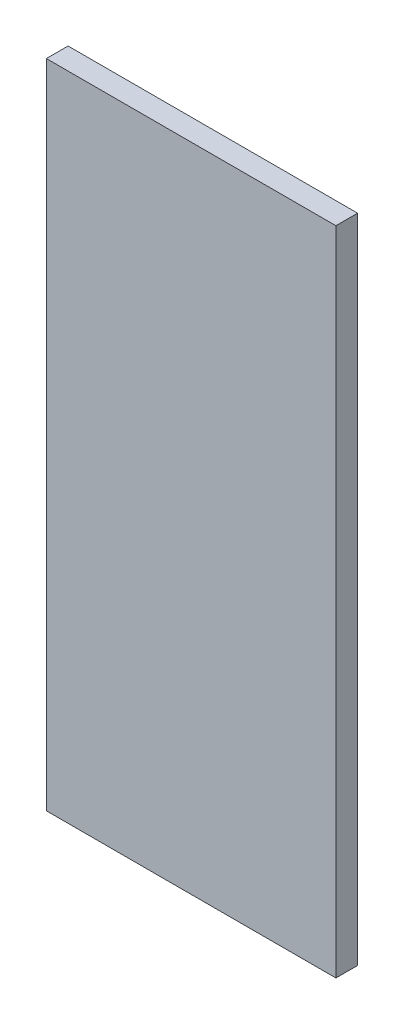
ISO-10303-21;
HEADER;
FILE_DESCRIPTION(('STEP AP214'),'2;1');
FILE_NAME('part.step','',(''),(''),'','','');
FILE_SCHEMA(('AUTOMOTIVE_DESIGN { 1 0 10303 214 1 1 1 1 }'));
ENDSEC;
DATA;
#1=APPLICATION_CONTEXT('core data for automotive mechanical design processes');
#2=APPLICATION_PROTOCOL_DEFINITION('international standard','automotive_design',2000,#1);
#3=PRODUCT_CONTEXT('',#1,'mechanical');
#4=PRODUCT('Part','Part','',(#3));
#5=PRODUCT_RELATED_PRODUCT_CATEGORY('part','',(#4));
#6=PRODUCT_DEFINITION_FORMATION('','',#4);
#7=PRODUCT_DEFINITION_CONTEXT('part definition',#1,'design');
#8=PRODUCT_DEFINITION('design','',#6,#7);
#9=PRODUCT_DEFINITION_SHAPE('','',#8);
#10=(LENGTH_UNIT() NAMED_UNIT(*) SI_UNIT(.MILLI.,.METRE.));
#11=(NAMED_UNIT(*) PLANE_ANGLE_UNIT() SI_UNIT($,.RADIAN.));
#12=(NAMED_UNIT(*) SI_UNIT($,.STERADIAN.) SOLID_ANGLE_UNIT());
#13=UNCERTAINTY_MEASURE_WITH_UNIT(LENGTH_MEASURE(1.E-05),#10,'distance_accuracy_value','');
#14=(GEOMETRIC_REPRESENTATION_CONTEXT(3) GLOBAL_UNCERTAINTY_ASSIGNED_CONTEXT((#13)) GLOBAL_UNIT_ASSIGNED_CONTEXT((#10,
#11,#12)) REPRESENTATION_CONTEXT('',''));
#15=CARTESIAN_POINT('',(0.,0.,0.));
#16=DIRECTION('',(0.,0.,1.));
#17=DIRECTION('',(1.,0.,0.));
#18=AXIS2_PLACEMENT_3D('',#15,#16,#17);
#19=CARTESIAN_POINT('',(-20.,45.,3.));
#20=DIRECTION('',(1.,0.,0.));
#21=DIRECTION('',(0.,0.,-1.));
#22=AXIS2_PLACEMENT_3D('',#19,#20,#21);
#23=PLANE('',#22);
#24=DIRECTION('',(0.,-1.,0.));
#25=VECTOR('',#24,1.);
#26=CARTESIAN_POINT('',(-20.,45.,0.));
#27=LINE('',#26,#25);
#28=CARTESIAN_POINT('',(-20.,45.,0.));
#29=VERTEX_POINT('',#28);
#30=CARTESIAN_POINT('',(-20.,-45.,0.));
#31=VERTEX_POINT('',#30);
#32=EDGE_CURVE('E102',#29,#31,#27,.T.);
#33=ORIENTED_EDGE('',*,*,#32,.T.);
#34=DIRECTION('',(0.,0.,-1.));
#35=VECTOR('',#34,1.);
#36=CARTESIAN_POINT('',(-20.,-45.,3.));
#37=LINE('',#36,#35);
#38=CARTESIAN_POINT('',(-20.,-45.,3.));
#39=VERTEX_POINT('',#38);
#40=EDGE_CURVE('E11',#39,#31,#37,.T.);
#41=ORIENTED_EDGE('',*,*,#40,.F.);
#42=DIRECTION('',(0.,-1.,0.));
#43=VECTOR('',#42,1.);
#44=CARTESIAN_POINT('',(-20.,45.,3.));
#45=LINE('',#44,#43);
#46=CARTESIAN_POINT('',(-20.,45.,3.));
#47=VERTEX_POINT('',#46);
#48=EDGE_CURVE('E90',#47,#39,#45,.T.);
#49=ORIENTED_EDGE('',*,*,#48,.F.);
#50=DIRECTION('',(0.,0.,-1.));
#51=VECTOR('',#50,1.);
#52=CARTESIAN_POINT('',(-20.,45.,3.));
#53=LINE('',#52,#51);
#54=EDGE_CURVE('E98',#47,#29,#53,.T.);
#55=ORIENTED_EDGE('',*,*,#54,.T.);
#56=EDGE_LOOP('',(#33,#41,#49,#55));
#57=FACE_BOUND('',#56,.T.);
#58=ADVANCED_FACE('F39',(#57),#23,.F.);
#59=CARTESIAN_POINT('',(-20.,-45.,3.));
#60=DIRECTION('',(0.,1.,0.));
#61=DIRECTION('',(0.,0.,1.));
#62=AXIS2_PLACEMENT_3D('',#59,#60,#61);
#63=PLANE('',#62);
#64=DIRECTION('',(1.,0.,0.));
#65=VECTOR('',#64,1.);
#66=CARTESIAN_POINT('',(-20.,-45.,0.));
#67=LINE('',#66,#65);
#68=CARTESIAN_POINT('',(20.,-45.,0.));
#69=VERTEX_POINT('',#68);
#70=EDGE_CURVE('E94',#31,#69,#67,.T.);
#71=ORIENTED_EDGE('',*,*,#70,.T.);
#72=DIRECTION('',(0.,0.,-1.));
#73=VECTOR('',#72,1.);
#74=CARTESIAN_POINT('',(20.,-45.,3.));
#75=LINE('',#74,#73);
#76=CARTESIAN_POINT('',(20.,-45.,3.));
#77=VERTEX_POINT('',#76);
#78=EDGE_CURVE('E47',#77,#69,#75,.T.);
#79=ORIENTED_EDGE('',*,*,#78,.F.);
#80=DIRECTION('',(1.,0.,0.));
#81=VECTOR('',#80,1.);
#82=CARTESIAN_POINT('',(-20.,-45.,3.));
#83=LINE('',#82,#81);
#84=EDGE_CURVE('E85',#39,#77,#83,.T.);
#85=ORIENTED_EDGE('',*,*,#84,.F.);
#86=ORIENTED_EDGE('',*,*,#40,.T.);
#87=EDGE_LOOP('',(#71,#79,#85,#86));
#88=FACE_BOUND('',#87,.T.);
#89=ADVANCED_FACE('F93',(#88),#63,.F.);
#90=CARTESIAN_POINT('',(20.,-45.,3.));
#91=DIRECTION('',(-1.,0.,0.));
#92=DIRECTION('',(0.,0.,1.));
#93=AXIS2_PLACEMENT_3D('',#90,#91,#92);
#94=PLANE('',#93);
#95=DIRECTION('',(0.,1.,0.));
#96=VECTOR('',#95,1.);
#97=CARTESIAN_POINT('',(20.,-45.,0.));
#98=LINE('',#97,#96);
#99=CARTESIAN_POINT('',(20.,45.,0.));
#100=VERTEX_POINT('',#99);
#101=EDGE_CURVE('E72',#69,#100,#98,.T.);
#102=ORIENTED_EDGE('',*,*,#101,.T.);
#103=DIRECTION('',(0.,0.,-1.));
#104=VECTOR('',#103,1.);
#105=CARTESIAN_POINT('',(20.,45.,3.));
#106=LINE('',#105,#104);
#107=CARTESIAN_POINT('',(20.,45.,3.));
#108=VERTEX_POINT('',#107);
#109=EDGE_CURVE('E95',#108,#100,#106,.T.);
#110=ORIENTED_EDGE('',*,*,#109,.F.);
#111=DIRECTION('',(0.,1.,0.));
#112=VECTOR('',#111,1.);
#113=CARTESIAN_POINT('',(20.,-45.,3.));
#114=LINE('',#113,#112);
#115=EDGE_CURVE('E88',#77,#108,#114,.T.);
#116=ORIENTED_EDGE('',*,*,#115,.F.);
#117=ORIENTED_EDGE('',*,*,#78,.T.);
#118=EDGE_LOOP('',(#102,#110,#116,#117));
#119=FACE_BOUND('',#118,.T.);
#120=ADVANCED_FACE('F96',(#119),#94,.F.);
#121=CARTESIAN_POINT('',(20.,45.,3.));
#122=DIRECTION('',(0.,-1.,0.));
#123=DIRECTION('',(0.,0.,-1.));
#124=AXIS2_PLACEMENT_3D('',#121,#122,#123);
#125=PLANE('',#124);
#126=DIRECTION('',(-1.,0.,0.));
#127=VECTOR('',#126,1.);
#128=CARTESIAN_POINT('',(20.,45.,0.));
#129=LINE('',#128,#127);
#130=EDGE_CURVE('E78',#100,#29,#129,.T.);
#131=ORIENTED_EDGE('',*,*,#130,.T.);
#132=ORIENTED_EDGE('',*,*,#54,.F.);
#133=DIRECTION('',(-1.,0.,0.));
#134=VECTOR('',#133,1.);
#135=CARTESIAN_POINT('',(20.,45.,3.));
#136=LINE('',#135,#134);
#137=EDGE_CURVE('E55',#108,#47,#136,.T.);
#138=ORIENTED_EDGE('',*,*,#137,.F.);
#139=ORIENTED_EDGE('',*,*,#109,.T.);
#140=EDGE_LOOP('',(#131,#132,#138,#139));
#141=FACE_BOUND('',#140,.T.);
#142=ADVANCED_FACE('F109',(#141),#125,.F.);
#143=CARTESIAN_POINT('',(0.,0.,3.));
#144=DIRECTION('',(0.,0.,1.));
#145=DIRECTION('',(1.,0.,0.));
#146=AXIS2_PLACEMENT_3D('',#143,#144,#145);
#147=PLANE('',#146);
#148=ORIENTED_EDGE('',*,*,#48,.T.);
#149=ORIENTED_EDGE('',*,*,#84,.T.);
#150=ORIENTED_EDGE('',*,*,#115,.T.);
#151=ORIENTED_EDGE('',*,*,#137,.T.);
#152=EDGE_LOOP('',(#148,#149,#150,#151));
#153=FACE_BOUND('',#152,.T.);
#154=ADVANCED_FACE('F86',(#153),#147,.T.);
#155=CARTESIAN_POINT('',(0.,0.,0.));
#156=DIRECTION('',(0.,0.,1.));
#157=DIRECTION('',(1.,0.,0.));
#158=AXIS2_PLACEMENT_3D('',#155,#156,#157);
#159=PLANE('',#158);
#160=ORIENTED_EDGE('',*,*,#32,.F.);
#161=ORIENTED_EDGE('',*,*,#130,.F.);
#162=ORIENTED_EDGE('',*,*,#101,.F.);
#163=ORIENTED_EDGE('',*,*,#70,.F.);
#164=EDGE_LOOP('',(#160,#161,#162,#163));
#165=FACE_BOUND('',#164,.T.);
#166=ADVANCED_FACE('F112',(#165),#159,.F.);
#167=CLOSED_SHELL('',(#58,#89,#120,#142,#154,#166));
#168=MANIFOLD_SOLID_BREP('B2',#167);
#169=ADVANCED_BREP_SHAPE_REPRESENTATION('',(#18,#168),#14);
#170=SHAPE_DEFINITION_REPRESENTATION(#9,#169);
ENDSEC;
END-ISO-10303-21;
